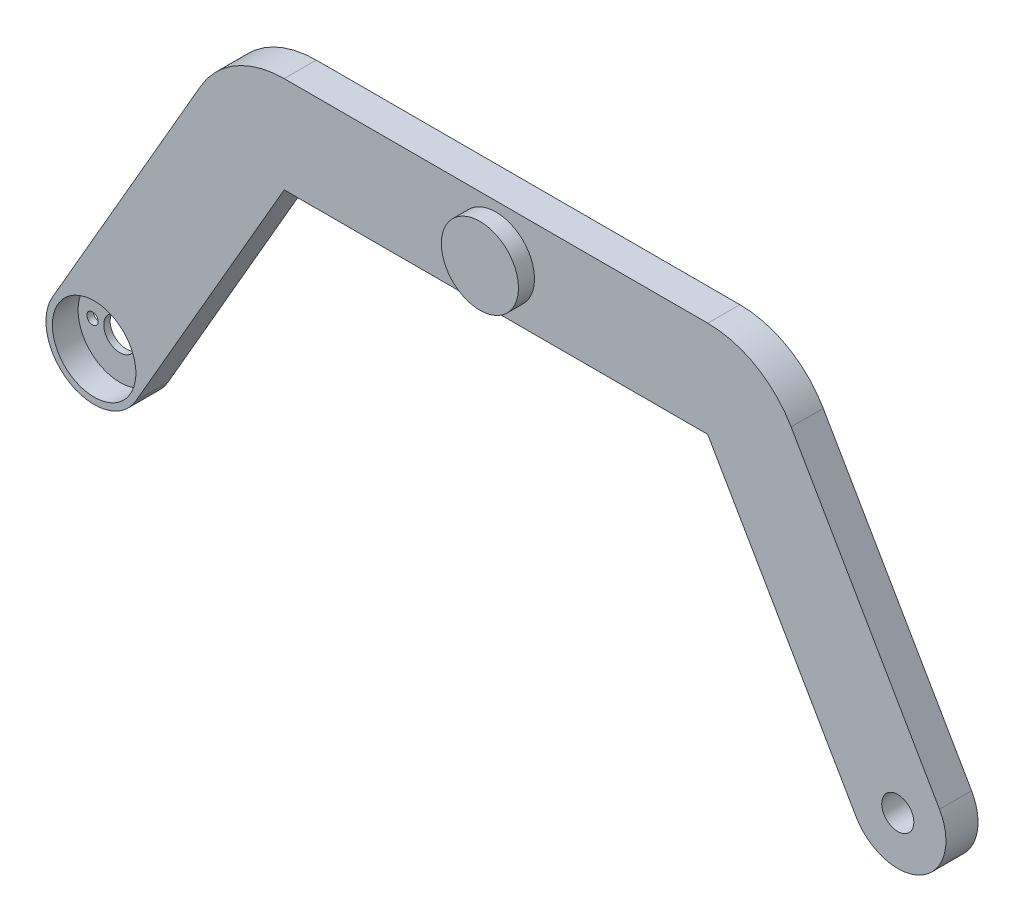
ISO-10303-21;
HEADER;
FILE_DESCRIPTION(('STEP AP214'),'2;1');
FILE_NAME('part.step','',(''),(''),'','','');
FILE_SCHEMA(('AUTOMOTIVE_DESIGN { 1 0 10303 214 1 1 1 1 }'));
ENDSEC;
DATA;
#1=APPLICATION_CONTEXT('core data for automotive mechanical design processes');
#2=APPLICATION_PROTOCOL_DEFINITION('international standard','automotive_design',2000,#1);
#3=PRODUCT_CONTEXT('',#1,'mechanical');
#4=PRODUCT('Part','Part','',(#3));
#5=PRODUCT_RELATED_PRODUCT_CATEGORY('part','',(#4));
#6=PRODUCT_DEFINITION_FORMATION('','',#4);
#7=PRODUCT_DEFINITION_CONTEXT('part definition',#1,'design');
#8=PRODUCT_DEFINITION('design','',#6,#7);
#9=PRODUCT_DEFINITION_SHAPE('','',#8);
#10=(LENGTH_UNIT() NAMED_UNIT(*) SI_UNIT(.MILLI.,.METRE.));
#11=(NAMED_UNIT(*) PLANE_ANGLE_UNIT() SI_UNIT($,.RADIAN.));
#12=(NAMED_UNIT(*) SI_UNIT($,.STERADIAN.) SOLID_ANGLE_UNIT());
#13=UNCERTAINTY_MEASURE_WITH_UNIT(LENGTH_MEASURE(1.E-05),#10,'distance_accuracy_value','');
#14=(GEOMETRIC_REPRESENTATION_CONTEXT(3) GLOBAL_UNCERTAINTY_ASSIGNED_CONTEXT((#13)) GLOBAL_UNIT_ASSIGNED_CONTEXT((#10,
#11,#12)) REPRESENTATION_CONTEXT('',''));
#15=CARTESIAN_POINT('',(0.,0.,0.));
#16=DIRECTION('',(0.,0.,1.));
#17=DIRECTION('',(1.,0.,0.));
#18=AXIS2_PLACEMENT_3D('',#15,#16,#17);
#19=CARTESIAN_POINT('',(-133.644870925994,-87.5182766758697,-10.));
#20=DIRECTION('',(0.,0.,1.));
#21=DIRECTION('',(-1.,0.,0.));
#22=AXIS2_PLACEMENT_3D('',#19,#20,#21);
#23=CYLINDRICAL_SURFACE('',#22,1.75000000000001);
#24=CARTESIAN_POINT('',(-133.644870925994,-87.5182766758697,-10.));
#25=DIRECTION('',(0.,0.,1.));
#26=DIRECTION('',(1.,0.,0.));
#27=AXIS2_PLACEMENT_3D('',#24,#25,#26);
#28=CIRCLE('',#27,1.75000000000001);
#29=CARTESIAN_POINT('',(-131.894870925994,-87.5182766758697,-10.));
#30=VERTEX_POINT('',#29);
#31=EDGE_CURVE('E156',#30,#30,#28,.T.);
#32=ORIENTED_EDGE('',*,*,#31,.F.);
#33=EDGE_LOOP('',(#32));
#34=FACE_BOUND('',#33,.T.);
#35=CARTESIAN_POINT('',(-133.644870925994,-87.5182766758697,-8.));
#36=DIRECTION('',(0.,0.,-1.));
#37=DIRECTION('',(-1.,0.,0.));
#38=AXIS2_PLACEMENT_3D('',#35,#36,#37);
#39=CIRCLE('',#38,1.75000000000001);
#40=CARTESIAN_POINT('',(-135.394870925994,-87.5182766758697,-8.));
#41=VERTEX_POINT('',#40);
#42=EDGE_CURVE('E482',#41,#41,#39,.T.);
#43=ORIENTED_EDGE('',*,*,#42,.F.);
#44=EDGE_LOOP('',(#43));
#45=FACE_BOUND('',#44,.T.);
#46=ADVANCED_FACE('F41',(#34,#45),#23,.F.);
#47=CARTESIAN_POINT('',(-116.644870925994,-87.5182766758697,-10.));
#48=DIRECTION('',(0.,0.,1.));
#49=DIRECTION('',(-1.,0.,0.));
#50=AXIS2_PLACEMENT_3D('',#47,#48,#49);
#51=CYLINDRICAL_SURFACE('',#50,1.75000000000004);
#52=CARTESIAN_POINT('',(-116.644870925994,-87.5182766758697,-10.));
#53=DIRECTION('',(0.,0.,1.));
#54=DIRECTION('',(1.,0.,0.));
#55=AXIS2_PLACEMENT_3D('',#52,#53,#54);
#56=CIRCLE('',#55,1.75000000000004);
#57=CARTESIAN_POINT('',(-114.894870925994,-87.5182766758697,-10.));
#58=VERTEX_POINT('',#57);
#59=EDGE_CURVE('E507',#58,#58,#56,.T.);
#60=ORIENTED_EDGE('',*,*,#59,.F.);
#61=EDGE_LOOP('',(#60));
#62=FACE_BOUND('',#61,.T.);
#63=CARTESIAN_POINT('',(-116.644870925994,-87.5182766758697,-8.));
#64=DIRECTION('',(0.,0.,-1.));
#65=DIRECTION('',(-1.,0.,0.));
#66=AXIS2_PLACEMENT_3D('',#63,#64,#65);
#67=CIRCLE('',#66,1.75000000000004);
#68=CARTESIAN_POINT('',(-118.394870925994,-87.5182766758697,-8.));
#69=VERTEX_POINT('',#68);
#70=EDGE_CURVE('E479',#69,#69,#67,.T.);
#71=ORIENTED_EDGE('',*,*,#70,.F.);
#72=EDGE_LOOP('',(#71));
#73=FACE_BOUND('',#72,.T.);
#74=ADVANCED_FACE('F239',(#62,#73),#51,.F.);
#75=CARTESIAN_POINT('',(-125.144870925994,-87.5182766758698,14.142135623731));
#76=DIRECTION('',(0.,0.,-1.));
#77=DIRECTION('',(1.,0.,0.));
#78=AXIS2_PLACEMENT_3D('',#75,#76,#77);
#79=CYLINDRICAL_SURFACE('',#78,5.00000000000001);
#80=CARTESIAN_POINT('',(-125.144870925994,-87.5182766758698,-10.));
#81=DIRECTION('',(0.,0.,1.));
#82=DIRECTION('',(1.,0.,0.));
#83=AXIS2_PLACEMENT_3D('',#80,#81,#82);
#84=CIRCLE('',#83,5.00000000000001);
#85=CARTESIAN_POINT('',(-120.144870925994,-87.5182766758698,-10.));
#86=VERTEX_POINT('',#85);
#87=EDGE_CURVE('E475',#86,#86,#84,.T.);
#88=ORIENTED_EDGE('',*,*,#87,.F.);
#89=EDGE_LOOP('',(#88));
#90=FACE_BOUND('',#89,.T.);
#91=CARTESIAN_POINT('',(-125.144870925994,-87.5182766758698,-8.));
#92=DIRECTION('',(0.,0.,-1.));
#93=DIRECTION('',(-1.,0.,0.));
#94=AXIS2_PLACEMENT_3D('',#91,#92,#93);
#95=CIRCLE('',#94,5.00000000000001);
#96=CARTESIAN_POINT('',(-130.144870925994,-87.5182766758698,-8.));
#97=VERTEX_POINT('',#96);
#98=EDGE_CURVE('E45',#97,#97,#95,.F.);
#99=ORIENTED_EDGE('',*,*,#98,.T.);
#100=EDGE_LOOP('',(#99));
#101=FACE_BOUND('',#100,.T.);
#102=ADVANCED_FACE('F245',(#90,#101),#79,.F.);
#103=CARTESIAN_POINT('',(-65.9559162903233,-15.,-10.));
#104=DIRECTION('',(0.,0.,1.));
#105=DIRECTION('',(-1.,0.,0.));
#106=AXIS2_PLACEMENT_3D('',#103,#104,#105);
#107=PLANE('',#106);
#108=CARTESIAN_POINT('',(0.,0.,-10.));
#109=DIRECTION('',(0.,0.,1.));
#110=DIRECTION('',(1.,0.,0.));
#111=AXIS2_PLACEMENT_3D('',#108,#109,#110);
#112=CIRCLE('',#111,5.);
#113=CARTESIAN_POINT('',(5.,0.,-10.));
#114=VERTEX_POINT('',#113);
#115=EDGE_CURVE('E501',#114,#114,#112,.T.);
#116=ORIENTED_EDGE('',*,*,#115,.T.);
#117=EDGE_LOOP('',(#116));
#118=FACE_BOUND('',#117,.T.);
#119=ORIENTED_EDGE('',*,*,#87,.T.);
#120=EDGE_LOOP('',(#119));
#121=FACE_BOUND('',#120,.T.);
#122=CARTESIAN_POINT('',(125.144870925994,-87.5182766758698,-10.));
#123=DIRECTION('',(0.,0.,1.));
#124=DIRECTION('',(1.,0.,0.));
#125=AXIS2_PLACEMENT_3D('',#122,#123,#124);
#126=CIRCLE('',#125,5.00000000000002);
#127=CARTESIAN_POINT('',(130.144870925994,-87.5182766758698,-10.));
#128=VERTEX_POINT('',#127);
#129=EDGE_CURVE('E509',#128,#128,#126,.T.);
#130=ORIENTED_EDGE('',*,*,#129,.T.);
#131=EDGE_LOOP('',(#130));
#132=FACE_BOUND('',#131,.T.);
#133=CARTESIAN_POINT('',(-65.9559162903233,-15.,-10.));
#134=DIRECTION('',(0.,0.,1.));
#135=DIRECTION('',(-1.,0.,0.));
#136=AXIS2_PLACEMENT_3D('',#133,#134,#135);
#137=CIRCLE('',#136,30.);
#138=CARTESIAN_POINT('',(-65.9559162903233,15.,-10.));
#139=VERTEX_POINT('',#138);
#140=CARTESIAN_POINT('',(-91.9366784038564,1.1698415145435E-13,-10.));
#141=VERTEX_POINT('',#140);
#142=EDGE_CURVE('E179',#139,#141,#137,.T.);
#143=ORIENTED_EDGE('',*,*,#142,.F.);
#144=DIRECTION('',(-1.,0.,0.));
#145=VECTOR('',#144,1.);
#146=CARTESIAN_POINT('',(65.9559162903233,15.,-10.));
#147=LINE('',#146,#145);
#148=CARTESIAN_POINT('',(65.9559162903233,15.,-10.));
#149=VERTEX_POINT('',#148);
#150=EDGE_CURVE('E147',#149,#139,#147,.T.);
#151=ORIENTED_EDGE('',*,*,#150,.F.);
#152=CARTESIAN_POINT('',(65.9559162903233,-15.,-10.));
#153=DIRECTION('',(0.,0.,1.));
#154=DIRECTION('',(1.,0.,0.));
#155=AXIS2_PLACEMENT_3D('',#152,#153,#154);
#156=CIRCLE('',#155,30.);
#157=CARTESIAN_POINT('',(91.9366784038564,1.196959198424E-13,-10.));
#158=VERTEX_POINT('',#157);
#159=EDGE_CURVE('E127',#158,#149,#156,.T.);
#160=ORIENTED_EDGE('',*,*,#159,.F.);
#161=DIRECTION('',(-0.500000000000004,0.866025403784436,0.));
#162=VECTOR('',#161,1.);
#163=CARTESIAN_POINT('',(138.13525198276,-80.0182766758697,-10.));
#164=LINE('',#163,#162);
#165=CARTESIAN_POINT('',(138.13525198276,-80.0182766758697,-10.));
#166=VERTEX_POINT('',#165);
#167=EDGE_CURVE('E137',#166,#158,#164,.T.);
#168=ORIENTED_EDGE('',*,*,#167,.F.);
#169=CARTESIAN_POINT('',(125.144870925994,-87.5182766758698,-10.));
#170=DIRECTION('',(0.,0.,1.));
#171=DIRECTION('',(1.,0.,0.));
#172=AXIS2_PLACEMENT_3D('',#169,#170,#171);
#173=CIRCLE('',#172,15.);
#174=CARTESIAN_POINT('',(112.154489869227,-95.0182766758698,-10.));
#175=VERTEX_POINT('',#174);
#176=EDGE_CURVE('E142',#175,#166,#173,.T.);
#177=ORIENTED_EDGE('',*,*,#176,.F.);
#178=DIRECTION('',(0.500000000000004,-0.866025403784436,0.));
#179=VECTOR('',#178,1.);
#180=CARTESIAN_POINT('',(65.9559162903233,-15.,-10.));
#181=LINE('',#180,#179);
#182=CARTESIAN_POINT('',(65.9559162903233,-15.,-10.));
#183=VERTEX_POINT('',#182);
#184=EDGE_CURVE('E214',#183,#175,#181,.T.);
#185=ORIENTED_EDGE('',*,*,#184,.F.);
#186=DIRECTION('',(1.,0.,0.));
#187=VECTOR('',#186,1.);
#188=CARTESIAN_POINT('',(65.9559162903233,-15.,-10.));
#189=LINE('',#188,#187);
#190=CARTESIAN_POINT('',(-65.9559162903233,-15.,-10.));
#191=VERTEX_POINT('',#190);
#192=EDGE_CURVE('E211',#191,#183,#189,.T.);
#193=ORIENTED_EDGE('',*,*,#192,.F.);
#194=DIRECTION('',(0.500000000000004,0.866025403784436,0.));
#195=VECTOR('',#194,1.);
#196=CARTESIAN_POINT('',(-65.9559162903233,-15.,-10.));
#197=LINE('',#196,#195);
#198=CARTESIAN_POINT('',(-112.154489869227,-95.0182766758698,-10.));
#199=VERTEX_POINT('',#198);
#200=EDGE_CURVE('E208',#199,#191,#197,.T.);
#201=ORIENTED_EDGE('',*,*,#200,.F.);
#202=CARTESIAN_POINT('',(-125.144870925994,-87.5182766758698,-10.));
#203=DIRECTION('',(0.,0.,1.));
#204=DIRECTION('',(1.,0.,0.));
#205=AXIS2_PLACEMENT_3D('',#202,#203,#204);
#206=CIRCLE('',#205,15.);
#207=CARTESIAN_POINT('',(-138.13525198276,-80.0182766758697,-10.));
#208=VERTEX_POINT('',#207);
#209=EDGE_CURVE('E202',#208,#199,#206,.T.);
#210=ORIENTED_EDGE('',*,*,#209,.F.);
#211=DIRECTION('',(-0.500000000000004,-0.866025403784436,0.));
#212=VECTOR('',#211,1.);
#213=CARTESIAN_POINT('',(-138.13525198276,-80.0182766758697,-10.));
#214=LINE('',#213,#212);
#215=EDGE_CURVE('E193',#141,#208,#214,.T.);
#216=ORIENTED_EDGE('',*,*,#215,.F.);
#217=EDGE_LOOP('',(#143,#151,#160,#168,#177,#185,#193,#201,#210,#216));
#218=FACE_BOUND('',#217,.T.);
#219=ORIENTED_EDGE('',*,*,#31,.T.);
#220=EDGE_LOOP('',(#219));
#221=FACE_BOUND('',#220,.T.);
#222=ORIENTED_EDGE('',*,*,#59,.T.);
#223=EDGE_LOOP('',(#222));
#224=FACE_BOUND('',#223,.T.);
#225=ADVANCED_FACE('F145',(#118,#121,#132,#218,#221,#224),#107,.F.);
#226=CARTESIAN_POINT('',(-65.9559162903233,-15.,0.));
#227=DIRECTION('',(0.,0.,1.));
#228=DIRECTION('',(-1.,0.,0.));
#229=AXIS2_PLACEMENT_3D('',#226,#227,#228);
#230=PLANE('',#229);
#231=CARTESIAN_POINT('',(-125.144870925994,-87.5182766758698,0.));
#232=DIRECTION('',(0.,0.,-1.));
#233=DIRECTION('',(-1.,0.,0.));
#234=AXIS2_PLACEMENT_3D('',#231,#232,#233);
#235=CIRCLE('',#234,13.);
#236=CARTESIAN_POINT('',(-138.144870925994,-87.5182766758698,0.));
#237=VERTEX_POINT('',#236);
#238=EDGE_CURVE('E485',#237,#237,#235,.T.);
#239=ORIENTED_EDGE('',*,*,#238,.T.);
#240=EDGE_LOOP('',(#239));
#241=FACE_BOUND('',#240,.T.);
#242=CARTESIAN_POINT('',(0.,0.,0.));
#243=DIRECTION('',(0.,0.,-1.));
#244=DIRECTION('',(-1.,0.,0.));
#245=AXIS2_PLACEMENT_3D('',#242,#243,#244);
#246=CIRCLE('',#245,12.);
#247=CARTESIAN_POINT('',(-12.,0.,0.));
#248=VERTEX_POINT('',#247);
#249=EDGE_CURVE('E494',#248,#248,#246,.T.);
#250=ORIENTED_EDGE('',*,*,#249,.T.);
#251=EDGE_LOOP('',(#250));
#252=FACE_BOUND('',#251,.T.);
#253=CARTESIAN_POINT('',(125.144870925994,-87.5182766758698,0.));
#254=DIRECTION('',(0.,0.,-1.));
#255=DIRECTION('',(-1.,0.,0.));
#256=AXIS2_PLACEMENT_3D('',#253,#254,#255);
#257=CIRCLE('',#256,5.00000000000002);
#258=CARTESIAN_POINT('',(120.144870925994,-87.5182766758698,0.));
#259=VERTEX_POINT('',#258);
#260=EDGE_CURVE('E498',#259,#259,#257,.F.);
#261=ORIENTED_EDGE('',*,*,#260,.F.);
#262=EDGE_LOOP('',(#261));
#263=FACE_BOUND('',#262,.T.);
#264=CARTESIAN_POINT('',(-65.9559162903233,-15.,0.));
#265=DIRECTION('',(0.,0.,1.));
#266=DIRECTION('',(-1.,0.,0.));
#267=AXIS2_PLACEMENT_3D('',#264,#265,#266);
#268=CIRCLE('',#267,30.);
#269=CARTESIAN_POINT('',(-65.9559162903233,15.,0.));
#270=VERTEX_POINT('',#269);
#271=CARTESIAN_POINT('',(-91.9366784038564,1.1698415145435E-13,0.));
#272=VERTEX_POINT('',#271);
#273=EDGE_CURVE('E152',#270,#272,#268,.T.);
#274=ORIENTED_EDGE('',*,*,#273,.T.);
#275=DIRECTION('',(-0.500000000000004,-0.866025403784436,0.));
#276=VECTOR('',#275,1.);
#277=CARTESIAN_POINT('',(-138.13525198276,-80.0182766758697,0.));
#278=LINE('',#277,#276);
#279=CARTESIAN_POINT('',(-138.13525198276,-80.0182766758697,0.));
#280=VERTEX_POINT('',#279);
#281=EDGE_CURVE('E155',#272,#280,#278,.T.);
#282=ORIENTED_EDGE('',*,*,#281,.T.);
#283=CARTESIAN_POINT('',(-125.144870925994,-87.5182766758698,0.));
#284=DIRECTION('',(0.,0.,1.));
#285=DIRECTION('',(1.,0.,0.));
#286=AXIS2_PLACEMENT_3D('',#283,#284,#285);
#287=CIRCLE('',#286,15.);
#288=CARTESIAN_POINT('',(-112.154489869227,-95.0182766758698,0.));
#289=VERTEX_POINT('',#288);
#290=EDGE_CURVE('E159',#280,#289,#287,.T.);
#291=ORIENTED_EDGE('',*,*,#290,.T.);
#292=DIRECTION('',(0.500000000000004,0.866025403784436,0.));
#293=VECTOR('',#292,1.);
#294=CARTESIAN_POINT('',(-65.9559162903233,-15.,0.));
#295=LINE('',#294,#293);
#296=CARTESIAN_POINT('',(-65.9559162903233,-15.,0.));
#297=VERTEX_POINT('',#296);
#298=EDGE_CURVE('E162',#289,#297,#295,.T.);
#299=ORIENTED_EDGE('',*,*,#298,.T.);
#300=DIRECTION('',(1.,0.,0.));
#301=VECTOR('',#300,1.);
#302=CARTESIAN_POINT('',(65.9559162903233,-15.,0.));
#303=LINE('',#302,#301);
#304=CARTESIAN_POINT('',(65.9559162903233,-15.,0.));
#305=VERTEX_POINT('',#304);
#306=EDGE_CURVE('E165',#297,#305,#303,.T.);
#307=ORIENTED_EDGE('',*,*,#306,.T.);
#308=DIRECTION('',(0.500000000000004,-0.866025403784436,0.));
#309=VECTOR('',#308,1.);
#310=CARTESIAN_POINT('',(65.9559162903233,-15.,0.));
#311=LINE('',#310,#309);
#312=CARTESIAN_POINT('',(112.154489869227,-95.0182766758698,0.));
#313=VERTEX_POINT('',#312);
#314=EDGE_CURVE('E168',#305,#313,#311,.T.);
#315=ORIENTED_EDGE('',*,*,#314,.T.);
#316=CARTESIAN_POINT('',(125.144870925994,-87.5182766758698,0.));
#317=DIRECTION('',(0.,0.,1.));
#318=DIRECTION('',(1.,0.,0.));
#319=AXIS2_PLACEMENT_3D('',#316,#317,#318);
#320=CIRCLE('',#319,15.);
#321=CARTESIAN_POINT('',(138.13525198276,-80.0182766758697,0.));
#322=VERTEX_POINT('',#321);
#323=EDGE_CURVE('E171',#313,#322,#320,.T.);
#324=ORIENTED_EDGE('',*,*,#323,.T.);
#325=DIRECTION('',(-0.500000000000004,0.866025403784436,0.));
#326=VECTOR('',#325,1.);
#327=CARTESIAN_POINT('',(138.13525198276,-80.0182766758697,0.));
#328=LINE('',#327,#326);
#329=CARTESIAN_POINT('',(91.9366784038564,1.196959198424E-13,0.));
#330=VERTEX_POINT('',#329);
#331=EDGE_CURVE('E174',#322,#330,#328,.T.);
#332=ORIENTED_EDGE('',*,*,#331,.T.);
#333=CARTESIAN_POINT('',(65.9559162903233,-15.,0.));
#334=DIRECTION('',(0.,0.,1.));
#335=DIRECTION('',(1.,0.,0.));
#336=AXIS2_PLACEMENT_3D('',#333,#334,#335);
#337=CIRCLE('',#336,30.);
#338=CARTESIAN_POINT('',(65.9559162903233,15.,0.));
#339=VERTEX_POINT('',#338);
#340=EDGE_CURVE('E130',#330,#339,#337,.T.);
#341=ORIENTED_EDGE('',*,*,#340,.T.);
#342=DIRECTION('',(-1.,0.,0.));
#343=VECTOR('',#342,1.);
#344=CARTESIAN_POINT('',(65.9559162903233,15.,0.));
#345=LINE('',#344,#343);
#346=EDGE_CURVE('E177',#339,#270,#345,.T.);
#347=ORIENTED_EDGE('',*,*,#346,.T.);
#348=EDGE_LOOP('',(#274,#282,#291,#299,#307,#315,#324,#332,#341,#347));
#349=FACE_BOUND('',#348,.T.);
#350=ADVANCED_FACE('F200',(#241,#252,#263,#349),#230,.T.);
#351=CARTESIAN_POINT('',(-65.9559162903233,-15.,-10.));
#352=DIRECTION('',(0.,0.,1.));
#353=DIRECTION('',(-1.,0.,0.));
#354=AXIS2_PLACEMENT_3D('',#351,#352,#353);
#355=CYLINDRICAL_SURFACE('',#354,30.);
#356=ORIENTED_EDGE('',*,*,#273,.F.);
#357=DIRECTION('',(0.,0.,1.));
#358=VECTOR('',#357,1.);
#359=CARTESIAN_POINT('',(-65.9559162903233,15.,-10.));
#360=LINE('',#359,#358);
#361=EDGE_CURVE('E59',#139,#270,#360,.T.);
#362=ORIENTED_EDGE('',*,*,#361,.F.);
#363=ORIENTED_EDGE('',*,*,#142,.T.);
#364=DIRECTION('',(0.,0.,1.));
#365=VECTOR('',#364,1.);
#366=CARTESIAN_POINT('',(-91.9366784038564,1.1698415145435E-13,-10.));
#367=LINE('',#366,#365);
#368=EDGE_CURVE('E12',#141,#272,#367,.T.);
#369=ORIENTED_EDGE('',*,*,#368,.T.);
#370=EDGE_LOOP('',(#356,#362,#363,#369));
#371=FACE_BOUND('',#370,.T.);
#372=ADVANCED_FACE('F43',(#371),#355,.T.);
#373=CARTESIAN_POINT('',(-138.13525198276,-80.0182766758697,-10.));
#374=DIRECTION('',(0.866025403784436,-0.500000000000004,0.));
#375=DIRECTION('',(0.500000000000004,0.866025403784436,0.));
#376=AXIS2_PLACEMENT_3D('',#373,#374,#375);
#377=PLANE('',#376);
#378=ORIENTED_EDGE('',*,*,#281,.F.);
#379=ORIENTED_EDGE('',*,*,#368,.F.);
#380=ORIENTED_EDGE('',*,*,#215,.T.);
#381=DIRECTION('',(0.,0.,1.));
#382=VECTOR('',#381,1.);
#383=CARTESIAN_POINT('',(-138.13525198276,-80.0182766758697,-10.));
#384=LINE('',#383,#382);
#385=EDGE_CURVE('E51',#208,#280,#384,.T.);
#386=ORIENTED_EDGE('',*,*,#385,.T.);
#387=EDGE_LOOP('',(#378,#379,#380,#386));
#388=FACE_BOUND('',#387,.T.);
#389=ADVANCED_FACE('F192',(#388),#377,.F.);
#390=CARTESIAN_POINT('',(-125.144870925994,-87.5182766758698,-10.));
#391=DIRECTION('',(0.,0.,1.));
#392=DIRECTION('',(-1.,0.,0.));
#393=AXIS2_PLACEMENT_3D('',#390,#391,#392);
#394=CYLINDRICAL_SURFACE('',#393,15.);
#395=ORIENTED_EDGE('',*,*,#290,.F.);
#396=ORIENTED_EDGE('',*,*,#385,.F.);
#397=ORIENTED_EDGE('',*,*,#209,.T.);
#398=DIRECTION('',(0.,0.,1.));
#399=VECTOR('',#398,1.);
#400=CARTESIAN_POINT('',(-112.154489869227,-95.0182766758698,-10.));
#401=LINE('',#400,#399);
#402=EDGE_CURVE('E189',#199,#289,#401,.T.);
#403=ORIENTED_EDGE('',*,*,#402,.T.);
#404=EDGE_LOOP('',(#395,#396,#397,#403));
#405=FACE_BOUND('',#404,.T.);
#406=ADVANCED_FACE('F197',(#405),#394,.T.);
#407=CARTESIAN_POINT('',(-65.9559162903233,-15.,-10.));
#408=DIRECTION('',(-0.866025403784437,0.500000000000004,0.));
#409=DIRECTION('',(-0.500000000000004,-0.866025403784437,0.));
#410=AXIS2_PLACEMENT_3D('',#407,#408,#409);
#411=PLANE('',#410);
#412=ORIENTED_EDGE('',*,*,#298,.F.);
#413=ORIENTED_EDGE('',*,*,#402,.F.);
#414=ORIENTED_EDGE('',*,*,#200,.T.);
#415=DIRECTION('',(0.,0.,1.));
#416=VECTOR('',#415,1.);
#417=CARTESIAN_POINT('',(-65.9559162903233,-15.,-10.));
#418=LINE('',#417,#416);
#419=EDGE_CURVE('E187',#191,#297,#418,.T.);
#420=ORIENTED_EDGE('',*,*,#419,.T.);
#421=EDGE_LOOP('',(#412,#413,#414,#420));
#422=FACE_BOUND('',#421,.T.);
#423=ADVANCED_FACE('F229',(#422),#411,.F.);
#424=CARTESIAN_POINT('',(65.9559162903233,-15.,-10.));
#425=DIRECTION('',(0.,1.,0.));
#426=DIRECTION('',(0.,0.,-1.));
#427=AXIS2_PLACEMENT_3D('',#424,#425,#426);
#428=PLANE('',#427);
#429=ORIENTED_EDGE('',*,*,#306,.F.);
#430=ORIENTED_EDGE('',*,*,#419,.F.);
#431=ORIENTED_EDGE('',*,*,#192,.T.);
#432=DIRECTION('',(0.,0.,1.));
#433=VECTOR('',#432,1.);
#434=CARTESIAN_POINT('',(65.9559162903233,-15.,-10.));
#435=LINE('',#434,#433);
#436=EDGE_CURVE('E185',#183,#305,#435,.T.);
#437=ORIENTED_EDGE('',*,*,#436,.T.);
#438=EDGE_LOOP('',(#429,#430,#431,#437));
#439=FACE_BOUND('',#438,.T.);
#440=ADVANCED_FACE('F227',(#439),#428,.F.);
#441=CARTESIAN_POINT('',(65.9559162903233,-15.,-10.));
#442=DIRECTION('',(0.866025403784437,0.500000000000004,0.));
#443=DIRECTION('',(-0.500000000000004,0.866025403784437,0.));
#444=AXIS2_PLACEMENT_3D('',#441,#442,#443);
#445=PLANE('',#444);
#446=ORIENTED_EDGE('',*,*,#314,.F.);
#447=ORIENTED_EDGE('',*,*,#436,.F.);
#448=ORIENTED_EDGE('',*,*,#184,.T.);
#449=DIRECTION('',(0.,0.,1.));
#450=VECTOR('',#449,1.);
#451=CARTESIAN_POINT('',(112.154489869227,-95.0182766758698,-10.));
#452=LINE('',#451,#450);
#453=EDGE_CURVE('E183',#175,#313,#452,.T.);
#454=ORIENTED_EDGE('',*,*,#453,.T.);
#455=EDGE_LOOP('',(#446,#447,#448,#454));
#456=FACE_BOUND('',#455,.T.);
#457=ADVANCED_FACE('F224',(#456),#445,.F.);
#458=CARTESIAN_POINT('',(125.144870925994,-87.5182766758698,-10.));
#459=DIRECTION('',(0.,0.,1.));
#460=DIRECTION('',(-1.,0.,0.));
#461=AXIS2_PLACEMENT_3D('',#458,#459,#460);
#462=CYLINDRICAL_SURFACE('',#461,15.);
#463=ORIENTED_EDGE('',*,*,#323,.F.);
#464=ORIENTED_EDGE('',*,*,#453,.F.);
#465=ORIENTED_EDGE('',*,*,#176,.T.);
#466=DIRECTION('',(0.,0.,1.));
#467=VECTOR('',#466,1.);
#468=CARTESIAN_POINT('',(138.13525198276,-80.0182766758697,-10.));
#469=LINE('',#468,#467);
#470=EDGE_CURVE('E134',#166,#322,#469,.T.);
#471=ORIENTED_EDGE('',*,*,#470,.T.);
#472=EDGE_LOOP('',(#463,#464,#465,#471));
#473=FACE_BOUND('',#472,.T.);
#474=ADVANCED_FACE('F218',(#473),#462,.T.);
#475=CARTESIAN_POINT('',(138.13525198276,-80.0182766758697,-10.));
#476=DIRECTION('',(-0.866025403784436,-0.500000000000004,0.));
#477=DIRECTION('',(0.500000000000004,-0.866025403784436,0.));
#478=AXIS2_PLACEMENT_3D('',#475,#476,#477);
#479=PLANE('',#478);
#480=ORIENTED_EDGE('',*,*,#331,.F.);
#481=ORIENTED_EDGE('',*,*,#470,.F.);
#482=ORIENTED_EDGE('',*,*,#167,.T.);
#483=DIRECTION('',(0.,0.,1.));
#484=VECTOR('',#483,1.);
#485=CARTESIAN_POINT('',(91.9366784038564,1.196959198424E-13,-10.));
#486=LINE('',#485,#484);
#487=EDGE_CURVE('E123',#158,#330,#486,.T.);
#488=ORIENTED_EDGE('',*,*,#487,.T.);
#489=EDGE_LOOP('',(#480,#481,#482,#488));
#490=FACE_BOUND('',#489,.T.);
#491=ADVANCED_FACE('F138',(#490),#479,.F.);
#492=CARTESIAN_POINT('',(65.9559162903233,-15.,-10.));
#493=DIRECTION('',(0.,0.,1.));
#494=DIRECTION('',(-1.,0.,0.));
#495=AXIS2_PLACEMENT_3D('',#492,#493,#494);
#496=CYLINDRICAL_SURFACE('',#495,30.);
#497=ORIENTED_EDGE('',*,*,#340,.F.);
#498=ORIENTED_EDGE('',*,*,#487,.F.);
#499=ORIENTED_EDGE('',*,*,#159,.T.);
#500=DIRECTION('',(0.,0.,1.));
#501=VECTOR('',#500,1.);
#502=CARTESIAN_POINT('',(65.9559162903233,15.,-10.));
#503=LINE('',#502,#501);
#504=EDGE_CURVE('E93',#149,#339,#503,.T.);
#505=ORIENTED_EDGE('',*,*,#504,.T.);
#506=EDGE_LOOP('',(#497,#498,#499,#505));
#507=FACE_BOUND('',#506,.T.);
#508=ADVANCED_FACE('F125',(#507),#496,.T.);
#509=CARTESIAN_POINT('',(65.9559162903233,15.,-10.));
#510=DIRECTION('',(0.,-1.,0.));
#511=DIRECTION('',(0.,0.,1.));
#512=AXIS2_PLACEMENT_3D('',#509,#510,#511);
#513=PLANE('',#512);
#514=ORIENTED_EDGE('',*,*,#346,.F.);
#515=ORIENTED_EDGE('',*,*,#504,.F.);
#516=ORIENTED_EDGE('',*,*,#150,.T.);
#517=ORIENTED_EDGE('',*,*,#361,.T.);
#518=EDGE_LOOP('',(#514,#515,#516,#517));
#519=FACE_BOUND('',#518,.T.);
#520=ADVANCED_FACE('F258',(#519),#513,.F.);
#521=CARTESIAN_POINT('',(125.144870925994,-87.5182766758698,14.142135623731));
#522=DIRECTION('',(0.,0.,-1.));
#523=DIRECTION('',(1.,0.,0.));
#524=AXIS2_PLACEMENT_3D('',#521,#522,#523);
#525=CYLINDRICAL_SURFACE('',#524,5.00000000000002);
#526=ORIENTED_EDGE('',*,*,#129,.F.);
#527=EDGE_LOOP('',(#526));
#528=FACE_BOUND('',#527,.T.);
#529=ORIENTED_EDGE('',*,*,#260,.T.);
#530=EDGE_LOOP('',(#529));
#531=FACE_BOUND('',#530,.T.);
#532=ADVANCED_FACE('F261',(#528,#531),#525,.F.);
#533=CARTESIAN_POINT('',(0.,0.,14.142135623731));
#534=DIRECTION('',(0.,0.,-1.));
#535=DIRECTION('',(1.,0.,0.));
#536=AXIS2_PLACEMENT_3D('',#533,#534,#535);
#537=CYLINDRICAL_SURFACE('',#536,5.);
#538=ORIENTED_EDGE('',*,*,#115,.F.);
#539=EDGE_LOOP('',(#538));
#540=FACE_BOUND('',#539,.T.);
#541=CARTESIAN_POINT('',(0.,0.,0.));
#542=DIRECTION('',(0.,0.,-1.));
#543=DIRECTION('',(-1.,0.,0.));
#544=AXIS2_PLACEMENT_3D('',#541,#542,#543);
#545=CIRCLE('',#544,5.);
#546=CARTESIAN_POINT('',(-5.,0.,0.));
#547=VERTEX_POINT('',#546);
#548=EDGE_CURVE('E504',#547,#547,#545,.F.);
#549=ORIENTED_EDGE('',*,*,#548,.T.);
#550=EDGE_LOOP('',(#549));
#551=FACE_BOUND('',#550,.T.);
#552=ADVANCED_FACE('F295',(#540,#551),#537,.F.);
#553=CARTESIAN_POINT('',(0.,0.,0.));
#554=DIRECTION('',(0.,0.,1.));
#555=DIRECTION('',(-1.,0.,0.));
#556=AXIS2_PLACEMENT_3D('',#553,#554,#555);
#557=PLANE('',#556);
#558=ORIENTED_EDGE('',*,*,#548,.F.);
#559=EDGE_LOOP('',(#558));
#560=FACE_BOUND('',#559,.T.);
#561=ADVANCED_FACE('F302',(#560),#557,.F.);
#562=CARTESIAN_POINT('',(0.,0.,5.));
#563=DIRECTION('',(0.,0.,-1.));
#564=DIRECTION('',(1.,0.,0.));
#565=AXIS2_PLACEMENT_3D('',#562,#563,#564);
#566=CYLINDRICAL_SURFACE('',#565,12.);
#567=CARTESIAN_POINT('',(0.,0.,5.));
#568=DIRECTION('',(0.,0.,-1.));
#569=DIRECTION('',(-1.,0.,0.));
#570=AXIS2_PLACEMENT_3D('',#567,#568,#569);
#571=CIRCLE('',#570,12.);
#572=CARTESIAN_POINT('',(-12.,0.,5.));
#573=VERTEX_POINT('',#572);
#574=EDGE_CURVE('E495',#573,#573,#571,.T.);
#575=ORIENTED_EDGE('',*,*,#574,.T.);
#576=EDGE_LOOP('',(#575));
#577=FACE_BOUND('',#576,.T.);
#578=ORIENTED_EDGE('',*,*,#249,.F.);
#579=EDGE_LOOP('',(#578));
#580=FACE_BOUND('',#579,.T.);
#581=ADVANCED_FACE('F310',(#577,#580),#566,.T.);
#582=CARTESIAN_POINT('',(0.,0.,5.));
#583=DIRECTION('',(0.,0.,1.));
#584=DIRECTION('',(-1.,0.,0.));
#585=AXIS2_PLACEMENT_3D('',#582,#583,#584);
#586=PLANE('',#585);
#587=ORIENTED_EDGE('',*,*,#574,.F.);
#588=EDGE_LOOP('',(#587));
#589=FACE_BOUND('',#588,.T.);
#590=ADVANCED_FACE('F318',(#589),#586,.T.);
#591=CARTESIAN_POINT('',(-65.9559162903233,-15.,-8.));
#592=DIRECTION('',(0.,0.,1.));
#593=DIRECTION('',(-1.,0.,0.));
#594=AXIS2_PLACEMENT_3D('',#591,#592,#593);
#595=PLANE('',#594);
#596=ORIENTED_EDGE('',*,*,#42,.T.);
#597=EDGE_LOOP('',(#596));
#598=FACE_BOUND('',#597,.T.);
#599=ORIENTED_EDGE('',*,*,#70,.T.);
#600=EDGE_LOOP('',(#599));
#601=FACE_BOUND('',#600,.T.);
#602=CARTESIAN_POINT('',(-125.144870925994,-87.5182766758698,-8.));
#603=DIRECTION('',(0.,0.,-1.));
#604=DIRECTION('',(-1.,0.,0.));
#605=AXIS2_PLACEMENT_3D('',#602,#603,#604);
#606=CIRCLE('',#605,13.);
#607=CARTESIAN_POINT('',(-138.144870925994,-87.5182766758698,-8.));
#608=VERTEX_POINT('',#607);
#609=EDGE_CURVE('E480',#608,#608,#606,.F.);
#610=ORIENTED_EDGE('',*,*,#609,.T.);
#611=EDGE_LOOP('',(#610));
#612=FACE_BOUND('',#611,.T.);
#613=ORIENTED_EDGE('',*,*,#98,.F.);
#614=EDGE_LOOP('',(#613));
#615=FACE_BOUND('',#614,.T.);
#616=ADVANCED_FACE('F326',(#598,#601,#612,#615),#595,.T.);
#617=CARTESIAN_POINT('',(-125.144870925994,-87.5182766758698,-46.7695526217004));
#618=DIRECTION('',(0.,0.,1.));
#619=DIRECTION('',(-1.,0.,0.));
#620=AXIS2_PLACEMENT_3D('',#617,#618,#619);
#621=CYLINDRICAL_SURFACE('',#620,13.);
#622=ORIENTED_EDGE('',*,*,#609,.F.);
#623=EDGE_LOOP('',(#622));
#624=FACE_BOUND('',#623,.T.);
#625=ORIENTED_EDGE('',*,*,#238,.F.);
#626=EDGE_LOOP('',(#625));
#627=FACE_BOUND('',#626,.T.);
#628=ADVANCED_FACE('F334',(#624,#627),#621,.F.);
#629=CLOSED_SHELL('',(#46,#74,#102,#225,#350,#372,#389,#406,#423,#440,#457,#474,#491,#508,#520,
#532,#552,#561,#581,#590,#616,#628));
#630=MANIFOLD_SOLID_BREP('B2',#629);
#631=ADVANCED_BREP_SHAPE_REPRESENTATION('',(#18,#630),#14);
#632=SHAPE_DEFINITION_REPRESENTATION(#9,#631);
ENDSEC;
END-ISO-10303-21;
